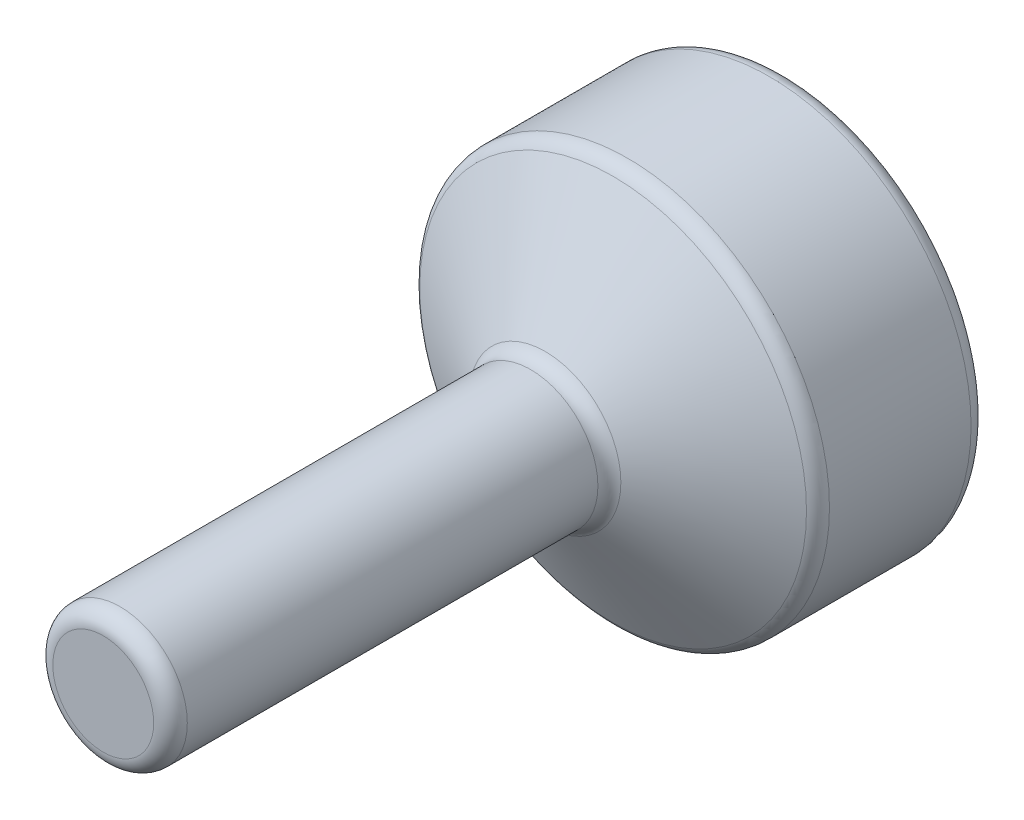
ISO-10303-21;
HEADER;
FILE_DESCRIPTION(('STEP AP214'),'2;1');
FILE_NAME('part.step','',(''),(''),'','','');
FILE_SCHEMA(('AUTOMOTIVE_DESIGN { 1 0 10303 214 1 1 1 1 }'));
ENDSEC;
DATA;
#1=APPLICATION_CONTEXT('core data for automotive mechanical design processes');
#2=APPLICATION_PROTOCOL_DEFINITION('international standard','automotive_design',2000,#1);
#3=PRODUCT_CONTEXT('',#1,'mechanical');
#4=PRODUCT('Part','Part','',(#3));
#5=PRODUCT_RELATED_PRODUCT_CATEGORY('part','',(#4));
#6=PRODUCT_DEFINITION_FORMATION('','',#4);
#7=PRODUCT_DEFINITION_CONTEXT('part definition',#1,'design');
#8=PRODUCT_DEFINITION('design','',#6,#7);
#9=PRODUCT_DEFINITION_SHAPE('','',#8);
#10=(LENGTH_UNIT() NAMED_UNIT(*) SI_UNIT(.MILLI.,.METRE.));
#11=(NAMED_UNIT(*) PLANE_ANGLE_UNIT() SI_UNIT($,.RADIAN.));
#12=(NAMED_UNIT(*) SI_UNIT($,.STERADIAN.) SOLID_ANGLE_UNIT());
#13=UNCERTAINTY_MEASURE_WITH_UNIT(LENGTH_MEASURE(1.E-05),#10,'distance_accuracy_value','');
#14=(GEOMETRIC_REPRESENTATION_CONTEXT(3) GLOBAL_UNCERTAINTY_ASSIGNED_CONTEXT((#13)) GLOBAL_UNIT_ASSIGNED_CONTEXT((#10,
#11,#12)) REPRESENTATION_CONTEXT('',''));
#15=CARTESIAN_POINT('',(0.,0.,0.));
#16=DIRECTION('',(0.,0.,1.));
#17=DIRECTION('',(1.,0.,0.));
#18=AXIS2_PLACEMENT_3D('',#15,#16,#17);
#19=CARTESIAN_POINT('',(0.,0.,0.));
#20=DIRECTION('',(0.,0.,-1.));
#21=DIRECTION('',(-1.,0.,0.));
#22=AXIS2_PLACEMENT_3D('',#19,#20,#21);
#23=PLANE('',#22);
#24=CARTESIAN_POINT('',(0.,0.,0.));
#25=DIRECTION('',(0.,0.,-1.));
#26=DIRECTION('',(-1.,0.,0.));
#27=AXIS2_PLACEMENT_3D('',#24,#25,#26);
#28=CIRCLE('',#27,2.794);
#29=CARTESIAN_POINT('',(-2.794,0.,0.));
#30=VERTEX_POINT('',#29);
#31=EDGE_CURVE('E10',#30,#30,#28,.T.);
#32=ORIENTED_EDGE('',*,*,#31,.T.);
#33=EDGE_LOOP('',(#32));
#34=FACE_BOUND('',#33,.T.);
#35=ADVANCED_FACE('F31',(#34),#23,.T.);
#36=CARTESIAN_POINT('',(0.,0.,10.3171757469933));
#37=DIRECTION('',(0.,0.,1.));
#38=DIRECTION('',(1.,0.,0.));
#39=AXIS2_PLACEMENT_3D('',#36,#37,#38);
#40=CYLINDRICAL_SURFACE('',#39,3.048);
#41=CARTESIAN_POINT('',(0.,0.,2.39335303162583));
#42=DIRECTION('',(0.,0.,-1.));
#43=DIRECTION('',(-1.,0.,0.));
#44=AXIS2_PLACEMENT_3D('',#41,#42,#43);
#45=CIRCLE('',#44,3.048);
#46=CARTESIAN_POINT('',(-3.048,0.,2.39335303162583));
#47=VERTEX_POINT('',#46);
#48=EDGE_CURVE('E42',#47,#47,#45,.T.);
#49=ORIENTED_EDGE('',*,*,#48,.T.);
#50=EDGE_LOOP('',(#49));
#51=FACE_BOUND('',#50,.T.);
#52=CARTESIAN_POINT('',(0.,0.,0.254000000000001));
#53=DIRECTION('',(0.,0.,-1.));
#54=DIRECTION('',(-1.,0.,0.));
#55=AXIS2_PLACEMENT_3D('',#52,#53,#54);
#56=CIRCLE('',#55,3.048);
#57=CARTESIAN_POINT('',(-3.048,0.,0.254000000000001));
#58=VERTEX_POINT('',#57);
#59=EDGE_CURVE('E46',#58,#58,#56,.F.);
#60=ORIENTED_EDGE('',*,*,#59,.T.);
#61=EDGE_LOOP('',(#60));
#62=FACE_BOUND('',#61,.T.);
#63=ADVANCED_FACE('F79',(#51,#62),#40,.T.);
#64=CARTESIAN_POINT('',(0.,0.,3.71317574699331));
#65=DIRECTION('',(0.,0.,-1.));
#66=DIRECTION('',(-1.,0.,0.));
#67=AXIS2_PLACEMENT_3D('',#64,#65,#66);
#68=CONICAL_SURFACE('',#67,1.016,1.0471975511966);
#69=CARTESIAN_POINT('',(0.,0.,3.63985226280623));
#70=DIRECTION('',(0.,0.,-1.));
#71=DIRECTION('',(-1.,0.,0.));
#72=AXIS2_PLACEMENT_3D('',#69,#70,#71);
#73=CIRCLE('',#72,1.143);
#74=CARTESIAN_POINT('',(-1.143,0.,3.63985226280623));
#75=VERTEX_POINT('',#74);
#76=EDGE_CURVE('E51',#75,#75,#73,.T.);
#77=ORIENTED_EDGE('',*,*,#76,.T.);
#78=EDGE_LOOP('',(#77));
#79=FACE_BOUND('',#78,.T.);
#80=CARTESIAN_POINT('',(0.,0.,2.61332348418708));
#81=DIRECTION('',(0.,0.,1.));
#82=DIRECTION('',(1.,0.,0.));
#83=AXIS2_PLACEMENT_3D('',#80,#81,#82);
#84=CIRCLE('',#83,2.921);
#85=CARTESIAN_POINT('',(2.921,0.,2.61332348418708));
#86=VERTEX_POINT('',#85);
#87=EDGE_CURVE('E54',#86,#86,#84,.T.);
#88=ORIENTED_EDGE('',*,*,#87,.T.);
#89=EDGE_LOOP('',(#88));
#90=FACE_BOUND('',#89,.T.);
#91=ADVANCED_FACE('F84',(#79,#90),#68,.T.);
#92=CARTESIAN_POINT('',(0.,0.,10.3171757469933));
#93=DIRECTION('',(0.,0.,1.));
#94=DIRECTION('',(1.,0.,0.));
#95=AXIS2_PLACEMENT_3D('',#92,#93,#94);
#96=CYLINDRICAL_SURFACE('',#95,1.016);
#97=CARTESIAN_POINT('',(0.,0.,3.85982271536748));
#98=DIRECTION('',(0.,0.,1.));
#99=DIRECTION('',(1.,0.,0.));
#100=AXIS2_PLACEMENT_3D('',#97,#98,#99);
#101=CIRCLE('',#100,1.016);
#102=CARTESIAN_POINT('',(1.016,0.,3.85982271536748));
#103=VERTEX_POINT('',#102);
#104=EDGE_CURVE('E57',#103,#103,#101,.T.);
#105=ORIENTED_EDGE('',*,*,#104,.T.);
#106=EDGE_LOOP('',(#105));
#107=FACE_BOUND('',#106,.T.);
#108=CARTESIAN_POINT('',(0.,0.,10.0631757469933));
#109=DIRECTION('',(0.,0.,1.));
#110=DIRECTION('',(1.,0.,0.));
#111=AXIS2_PLACEMENT_3D('',#108,#109,#110);
#112=CIRCLE('',#111,1.016);
#113=CARTESIAN_POINT('',(1.016,0.,10.0631757469933));
#114=VERTEX_POINT('',#113);
#115=EDGE_CURVE('E60',#114,#114,#112,.F.);
#116=ORIENTED_EDGE('',*,*,#115,.T.);
#117=EDGE_LOOP('',(#116));
#118=FACE_BOUND('',#117,.T.);
#119=ADVANCED_FACE('F64',(#107,#118),#96,.T.);
#120=CARTESIAN_POINT('',(1.016,0.,10.3171757469933));
#121=DIRECTION('',(0.,0.,1.));
#122=DIRECTION('',(1.,0.,0.));
#123=AXIS2_PLACEMENT_3D('',#120,#121,#122);
#124=PLANE('',#123);
#125=CARTESIAN_POINT('',(0.,0.,10.3171757469933));
#126=DIRECTION('',(0.,0.,1.));
#127=DIRECTION('',(1.,0.,0.));
#128=AXIS2_PLACEMENT_3D('',#125,#126,#127);
#129=CIRCLE('',#128,0.762);
#130=CARTESIAN_POINT('',(0.762,0.,10.3171757469933));
#131=VERTEX_POINT('',#130);
#132=EDGE_CURVE('E38',#131,#131,#129,.T.);
#133=ORIENTED_EDGE('',*,*,#132,.T.);
#134=EDGE_LOOP('',(#133));
#135=FACE_BOUND('',#134,.T.);
#136=ADVANCED_FACE('F90',(#135),#124,.T.);
#137=CARTESIAN_POINT('',(0.,0.,3.85982271536748));
#138=DIRECTION('',(0.,0.,1.));
#139=DIRECTION('',(1.,0.,0.));
#140=AXIS2_PLACEMENT_3D('',#137,#138,#139);
#141=TOROIDAL_SURFACE('',#140,1.27,0.254);
#142=ORIENTED_EDGE('',*,*,#76,.F.);
#143=EDGE_LOOP('',(#142));
#144=FACE_BOUND('',#143,.T.);
#145=ORIENTED_EDGE('',*,*,#104,.F.);
#146=EDGE_LOOP('',(#145));
#147=FACE_BOUND('',#146,.T.);
#148=ADVANCED_FACE('F75',(#144,#147),#141,.F.);
#149=CARTESIAN_POINT('',(0.,0.,2.39335303162583));
#150=DIRECTION('',(0.,0.,-1.));
#151=DIRECTION('',(-1.,0.,0.));
#152=AXIS2_PLACEMENT_3D('',#149,#150,#151);
#153=TOROIDAL_SURFACE('',#152,2.794,0.254);
#154=ORIENTED_EDGE('',*,*,#48,.F.);
#155=EDGE_LOOP('',(#154));
#156=FACE_BOUND('',#155,.T.);
#157=ORIENTED_EDGE('',*,*,#87,.F.);
#158=EDGE_LOOP('',(#157));
#159=FACE_BOUND('',#158,.T.);
#160=ADVANCED_FACE('F69',(#156,#159),#153,.T.);
#161=CARTESIAN_POINT('',(0.,0.,10.0631757469933));
#162=DIRECTION('',(0.,0.,1.));
#163=DIRECTION('',(1.,0.,0.));
#164=AXIS2_PLACEMENT_3D('',#161,#162,#163);
#165=TOROIDAL_SURFACE('',#164,0.762,0.254);
#166=ORIENTED_EDGE('',*,*,#115,.F.);
#167=EDGE_LOOP('',(#166));
#168=FACE_BOUND('',#167,.T.);
#169=ORIENTED_EDGE('',*,*,#132,.F.);
#170=EDGE_LOOP('',(#169));
#171=FACE_BOUND('',#170,.T.);
#172=ADVANCED_FACE('F66',(#168,#171),#165,.T.);
#173=CARTESIAN_POINT('',(0.,0.,0.254000000000001));
#174=DIRECTION('',(0.,0.,-1.));
#175=DIRECTION('',(-1.,0.,0.));
#176=AXIS2_PLACEMENT_3D('',#173,#174,#175);
#177=TOROIDAL_SURFACE('',#176,2.794,0.254);
#178=ORIENTED_EDGE('',*,*,#31,.F.);
#179=EDGE_LOOP('',(#178));
#180=FACE_BOUND('',#179,.T.);
#181=ORIENTED_EDGE('',*,*,#59,.F.);
#182=EDGE_LOOP('',(#181));
#183=FACE_BOUND('',#182,.T.);
#184=ADVANCED_FACE('F33',(#180,#183),#177,.T.);
#185=CLOSED_SHELL('',(#35,#63,#91,#119,#136,#148,#160,#172,#184));
#186=MANIFOLD_SOLID_BREP('B2',#185);
#187=ADVANCED_BREP_SHAPE_REPRESENTATION('',(#18,#186),#14);
#188=SHAPE_DEFINITION_REPRESENTATION(#9,#187);
ENDSEC;
END-ISO-10303-21;
